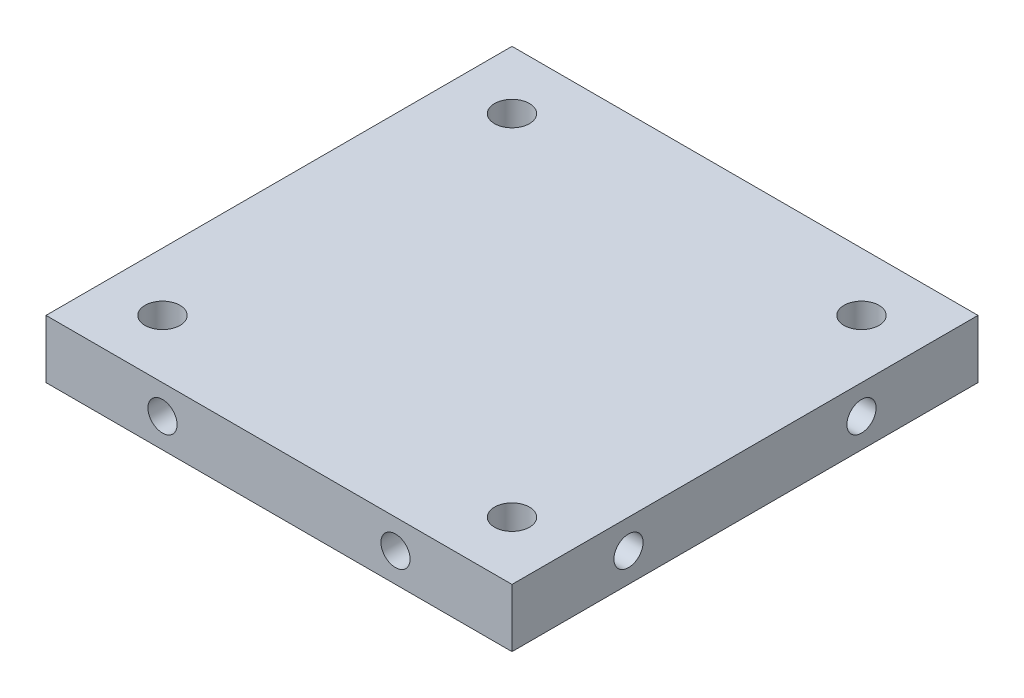
ISO-10303-21;
HEADER;
FILE_DESCRIPTION(('STEP AP214'),'2;1');
FILE_NAME('part.step','',(''),(''),'','','');
FILE_SCHEMA(('AUTOMOTIVE_DESIGN { 1 0 10303 214 1 1 1 1 }'));
ENDSEC;
DATA;
#1=APPLICATION_CONTEXT('core data for automotive mechanical design processes');
#2=APPLICATION_PROTOCOL_DEFINITION('international standard','automotive_design',2000,#1);
#3=PRODUCT_CONTEXT('',#1,'mechanical');
#4=PRODUCT('Part','Part','',(#3));
#5=PRODUCT_RELATED_PRODUCT_CATEGORY('part','',(#4));
#6=PRODUCT_DEFINITION_FORMATION('','',#4);
#7=PRODUCT_DEFINITION_CONTEXT('part definition',#1,'design');
#8=PRODUCT_DEFINITION('design','',#6,#7);
#9=PRODUCT_DEFINITION_SHAPE('','',#8);
#10=(LENGTH_UNIT() NAMED_UNIT(*) SI_UNIT(.MILLI.,.METRE.));
#11=(NAMED_UNIT(*) PLANE_ANGLE_UNIT() SI_UNIT($,.RADIAN.));
#12=(NAMED_UNIT(*) SI_UNIT($,.STERADIAN.) SOLID_ANGLE_UNIT());
#13=UNCERTAINTY_MEASURE_WITH_UNIT(LENGTH_MEASURE(1.E-05),#10,'distance_accuracy_value','');
#14=(GEOMETRIC_REPRESENTATION_CONTEXT(3) GLOBAL_UNCERTAINTY_ASSIGNED_CONTEXT((#13)) GLOBAL_UNIT_ASSIGNED_CONTEXT((#10,
#11,#12)) REPRESENTATION_CONTEXT('',''));
#15=CARTESIAN_POINT('',(0.,0.,0.));
#16=DIRECTION('',(0.,0.,1.));
#17=DIRECTION('',(1.,0.,0.));
#18=AXIS2_PLACEMENT_3D('',#15,#16,#17);
#19=CARTESIAN_POINT('',(20.,5.,20.));
#20=DIRECTION('',(-1.,0.,0.));
#21=DIRECTION('',(0.,0.,1.));
#22=AXIS2_PLACEMENT_3D('',#19,#20,#21);
#23=PLANE('',#22);
#24=CARTESIAN_POINT('',(20.,2.5,-10.0000000000001));
#25=DIRECTION('',(1.,0.,0.));
#26=DIRECTION('',(0.,0.,1.));
#27=AXIS2_PLACEMENT_3D('',#24,#25,#26);
#28=CIRCLE('',#27,1.25);
#29=CARTESIAN_POINT('',(20.,2.5,-8.75000000000007));
#30=VERTEX_POINT('',#29);
#31=EDGE_CURVE('E187',#30,#30,#28,.T.);
#32=ORIENTED_EDGE('',*,*,#31,.F.);
#33=EDGE_LOOP('',(#32));
#34=FACE_BOUND('',#33,.T.);
#35=CARTESIAN_POINT('',(20.,2.5,9.99999999999993));
#36=DIRECTION('',(1.,0.,0.));
#37=DIRECTION('',(0.,0.,-1.));
#38=AXIS2_PLACEMENT_3D('',#35,#36,#37);
#39=CIRCLE('',#38,1.25);
#40=CARTESIAN_POINT('',(20.,2.5,8.74999999999993));
#41=VERTEX_POINT('',#40);
#42=EDGE_CURVE('E165',#41,#41,#39,.T.);
#43=ORIENTED_EDGE('',*,*,#42,.F.);
#44=EDGE_LOOP('',(#43));
#45=FACE_BOUND('',#44,.T.);
#46=DIRECTION('',(0.,0.,-1.));
#47=VECTOR('',#46,1.);
#48=CARTESIAN_POINT('',(20.,0.,20.));
#49=LINE('',#48,#47);
#50=CARTESIAN_POINT('',(20.,0.,20.));
#51=VERTEX_POINT('',#50);
#52=CARTESIAN_POINT('',(20.,0.,-20.));
#53=VERTEX_POINT('',#52);
#54=EDGE_CURVE('E115',#51,#53,#49,.T.);
#55=ORIENTED_EDGE('',*,*,#54,.T.);
#56=DIRECTION('',(0.,-1.,0.));
#57=VECTOR('',#56,1.);
#58=CARTESIAN_POINT('',(20.,5.,-20.));
#59=LINE('',#58,#57);
#60=CARTESIAN_POINT('',(20.,5.,-20.));
#61=VERTEX_POINT('',#60);
#62=EDGE_CURVE('E11',#61,#53,#59,.T.);
#63=ORIENTED_EDGE('',*,*,#62,.F.);
#64=DIRECTION('',(0.,0.,-1.));
#65=VECTOR('',#64,1.);
#66=CARTESIAN_POINT('',(20.,5.,20.));
#67=LINE('',#66,#65);
#68=CARTESIAN_POINT('',(20.,5.,20.));
#69=VERTEX_POINT('',#68);
#70=EDGE_CURVE('E98',#69,#61,#67,.T.);
#71=ORIENTED_EDGE('',*,*,#70,.F.);
#72=DIRECTION('',(0.,-1.,0.));
#73=VECTOR('',#72,1.);
#74=CARTESIAN_POINT('',(20.,5.,20.));
#75=LINE('',#74,#73);
#76=EDGE_CURVE('E111',#69,#51,#75,.T.);
#77=ORIENTED_EDGE('',*,*,#76,.T.);
#78=EDGE_LOOP('',(#55,#63,#71,#77));
#79=FACE_BOUND('',#78,.T.);
#80=ADVANCED_FACE('F44',(#34,#45,#79),#23,.F.);
#81=CARTESIAN_POINT('',(-20.,5.,-20.));
#82=DIRECTION('',(0.,0.,1.));
#83=DIRECTION('',(1.,0.,0.));
#84=AXIS2_PLACEMENT_3D('',#81,#82,#83);
#85=PLANE('',#84);
#86=CARTESIAN_POINT('',(-10.,2.5,-20.));
#87=DIRECTION('',(0.,0.,-1.));
#88=DIRECTION('',(1.,0.,0.));
#89=AXIS2_PLACEMENT_3D('',#86,#87,#88);
#90=CIRCLE('',#89,1.25);
#91=CARTESIAN_POINT('',(-8.75,2.5,-20.));
#92=VERTEX_POINT('',#91);
#93=EDGE_CURVE('E203',#92,#92,#90,.T.);
#94=ORIENTED_EDGE('',*,*,#93,.F.);
#95=EDGE_LOOP('',(#94));
#96=FACE_BOUND('',#95,.T.);
#97=CARTESIAN_POINT('',(10.,2.5,-20.));
#98=DIRECTION('',(0.,0.,-1.));
#99=DIRECTION('',(-1.,0.,0.));
#100=AXIS2_PLACEMENT_3D('',#97,#98,#99);
#101=CIRCLE('',#100,1.25);
#102=CARTESIAN_POINT('',(8.75,2.5,-20.));
#103=VERTEX_POINT('',#102);
#104=EDGE_CURVE('E195',#103,#103,#101,.T.);
#105=ORIENTED_EDGE('',*,*,#104,.F.);
#106=EDGE_LOOP('',(#105));
#107=FACE_BOUND('',#106,.T.);
#108=DIRECTION('',(-1.,0.,0.));
#109=VECTOR('',#108,1.);
#110=CARTESIAN_POINT('',(-20.,0.,-20.));
#111=LINE('',#110,#109);
#112=CARTESIAN_POINT('',(-20.,0.,-20.));
#113=VERTEX_POINT('',#112);
#114=EDGE_CURVE('E103',#53,#113,#111,.T.);
#115=ORIENTED_EDGE('',*,*,#114,.T.);
#116=DIRECTION('',(0.,-1.,0.));
#117=VECTOR('',#116,1.);
#118=CARTESIAN_POINT('',(-20.,5.,-20.));
#119=LINE('',#118,#117);
#120=CARTESIAN_POINT('',(-20.,5.,-20.));
#121=VERTEX_POINT('',#120);
#122=EDGE_CURVE('E54',#121,#113,#119,.T.);
#123=ORIENTED_EDGE('',*,*,#122,.F.);
#124=DIRECTION('',(-1.,0.,0.));
#125=VECTOR('',#124,1.);
#126=CARTESIAN_POINT('',(-20.,5.,-20.));
#127=LINE('',#126,#125);
#128=EDGE_CURVE('E93',#61,#121,#127,.T.);
#129=ORIENTED_EDGE('',*,*,#128,.F.);
#130=ORIENTED_EDGE('',*,*,#62,.T.);
#131=EDGE_LOOP('',(#115,#123,#129,#130));
#132=FACE_BOUND('',#131,.T.);
#133=ADVANCED_FACE('F102',(#96,#107,#132),#85,.F.);
#134=CARTESIAN_POINT('',(-20.,5.,20.));
#135=DIRECTION('',(1.,0.,0.));
#136=DIRECTION('',(0.,0.,-1.));
#137=AXIS2_PLACEMENT_3D('',#134,#135,#136);
#138=PLANE('',#137);
#139=CARTESIAN_POINT('',(-19.9999999999999,2.5,10.0000000000002));
#140=DIRECTION('',(-1.,0.,0.));
#141=DIRECTION('',(0.,0.,-1.));
#142=AXIS2_PLACEMENT_3D('',#139,#140,#141);
#143=CIRCLE('',#142,1.25);
#144=CARTESIAN_POINT('',(-19.9999999999999,2.5,8.75000000000021));
#145=VERTEX_POINT('',#144);
#146=EDGE_CURVE('E145',#145,#145,#143,.T.);
#147=ORIENTED_EDGE('',*,*,#146,.F.);
#148=EDGE_LOOP('',(#147));
#149=FACE_BOUND('',#148,.T.);
#150=CARTESIAN_POINT('',(-20.0000000000001,2.5,-9.99999999999979));
#151=DIRECTION('',(-1.,0.,0.));
#152=DIRECTION('',(0.,0.,1.));
#153=AXIS2_PLACEMENT_3D('',#150,#151,#152);
#154=CIRCLE('',#153,1.25);
#155=CARTESIAN_POINT('',(-20.0000000000001,2.5,-8.74999999999979));
#156=VERTEX_POINT('',#155);
#157=EDGE_CURVE('E156',#156,#156,#154,.T.);
#158=ORIENTED_EDGE('',*,*,#157,.F.);
#159=EDGE_LOOP('',(#158));
#160=FACE_BOUND('',#159,.T.);
#161=DIRECTION('',(0.,0.,1.));
#162=VECTOR('',#161,1.);
#163=CARTESIAN_POINT('',(-20.,0.,20.));
#164=LINE('',#163,#162);
#165=CARTESIAN_POINT('',(-20.,0.,20.));
#166=VERTEX_POINT('',#165);
#167=EDGE_CURVE('E80',#113,#166,#164,.T.);
#168=ORIENTED_EDGE('',*,*,#167,.T.);
#169=DIRECTION('',(0.,-1.,0.));
#170=VECTOR('',#169,1.);
#171=CARTESIAN_POINT('',(-20.,5.,20.));
#172=LINE('',#171,#170);
#173=CARTESIAN_POINT('',(-20.,5.,20.));
#174=VERTEX_POINT('',#173);
#175=EDGE_CURVE('E105',#174,#166,#172,.T.);
#176=ORIENTED_EDGE('',*,*,#175,.F.);
#177=DIRECTION('',(0.,0.,1.));
#178=VECTOR('',#177,1.);
#179=CARTESIAN_POINT('',(-20.,5.,20.));
#180=LINE('',#179,#178);
#181=EDGE_CURVE('E96',#121,#174,#180,.T.);
#182=ORIENTED_EDGE('',*,*,#181,.F.);
#183=ORIENTED_EDGE('',*,*,#122,.T.);
#184=EDGE_LOOP('',(#168,#176,#182,#183));
#185=FACE_BOUND('',#184,.T.);
#186=ADVANCED_FACE('F107',(#149,#160,#185),#138,.F.);
#187=CARTESIAN_POINT('',(-20.,5.,20.));
#188=DIRECTION('',(0.,0.,-1.));
#189=DIRECTION('',(-1.,0.,0.));
#190=AXIS2_PLACEMENT_3D('',#187,#188,#189);
#191=PLANE('',#190);
#192=CARTESIAN_POINT('',(-10.,2.5,20.));
#193=DIRECTION('',(0.,0.,1.));
#194=DIRECTION('',(1.,0.,0.));
#195=AXIS2_PLACEMENT_3D('',#192,#193,#194);
#196=CIRCLE('',#195,1.25);
#197=CARTESIAN_POINT('',(-8.75,2.5,20.));
#198=VERTEX_POINT('',#197);
#199=EDGE_CURVE('E173',#198,#198,#196,.T.);
#200=ORIENTED_EDGE('',*,*,#199,.F.);
#201=EDGE_LOOP('',(#200));
#202=FACE_BOUND('',#201,.T.);
#203=CARTESIAN_POINT('',(10.,2.5,20.));
#204=DIRECTION('',(0.,0.,1.));
#205=DIRECTION('',(-1.,0.,0.));
#206=AXIS2_PLACEMENT_3D('',#203,#204,#205);
#207=CIRCLE('',#206,1.25);
#208=CARTESIAN_POINT('',(8.75,2.5,20.));
#209=VERTEX_POINT('',#208);
#210=EDGE_CURVE('E177',#209,#209,#207,.T.);
#211=ORIENTED_EDGE('',*,*,#210,.F.);
#212=EDGE_LOOP('',(#211));
#213=FACE_BOUND('',#212,.T.);
#214=DIRECTION('',(1.,0.,0.));
#215=VECTOR('',#214,1.);
#216=CARTESIAN_POINT('',(-20.,0.,20.));
#217=LINE('',#216,#215);
#218=EDGE_CURVE('E86',#166,#51,#217,.T.);
#219=ORIENTED_EDGE('',*,*,#218,.T.);
#220=ORIENTED_EDGE('',*,*,#76,.F.);
#221=DIRECTION('',(1.,0.,0.));
#222=VECTOR('',#221,1.);
#223=CARTESIAN_POINT('',(-20.,5.,20.));
#224=LINE('',#223,#222);
#225=EDGE_CURVE('E63',#174,#69,#224,.T.);
#226=ORIENTED_EDGE('',*,*,#225,.F.);
#227=ORIENTED_EDGE('',*,*,#175,.T.);
#228=EDGE_LOOP('',(#219,#220,#226,#227));
#229=FACE_BOUND('',#228,.T.);
#230=ADVANCED_FACE('F237',(#202,#213,#229),#191,.F.);
#231=CARTESIAN_POINT('',(0.,5.,0.));
#232=DIRECTION('',(0.,-1.,0.));
#233=DIRECTION('',(0.,0.,-1.));
#234=AXIS2_PLACEMENT_3D('',#231,#232,#233);
#235=PLANE('',#234);
#236=CARTESIAN_POINT('',(-15.,5.,15.));
#237=DIRECTION('',(0.,1.,0.));
#238=DIRECTION('',(0.,0.,1.));
#239=AXIS2_PLACEMENT_3D('',#236,#237,#238);
#240=CIRCLE('',#239,1.5);
#241=CARTESIAN_POINT('',(-15.,5.,16.5));
#242=VERTEX_POINT('',#241);
#243=EDGE_CURVE('E220',#242,#242,#240,.T.);
#244=ORIENTED_EDGE('',*,*,#243,.F.);
#245=EDGE_LOOP('',(#244));
#246=FACE_BOUND('',#245,.T.);
#247=CARTESIAN_POINT('',(15.,5.,15.));
#248=DIRECTION('',(0.,1.,0.));
#249=DIRECTION('',(0.,0.,1.));
#250=AXIS2_PLACEMENT_3D('',#247,#248,#249);
#251=CIRCLE('',#250,1.5);
#252=CARTESIAN_POINT('',(15.,5.,16.5));
#253=VERTEX_POINT('',#252);
#254=EDGE_CURVE('E224',#253,#253,#251,.T.);
#255=ORIENTED_EDGE('',*,*,#254,.F.);
#256=EDGE_LOOP('',(#255));
#257=FACE_BOUND('',#256,.T.);
#258=CARTESIAN_POINT('',(15.,5.,-15.));
#259=DIRECTION('',(0.,1.,0.));
#260=DIRECTION('',(0.,0.,1.));
#261=AXIS2_PLACEMENT_3D('',#258,#259,#260);
#262=CIRCLE('',#261,1.5);
#263=CARTESIAN_POINT('',(15.,5.,-13.5));
#264=VERTEX_POINT('',#263);
#265=EDGE_CURVE('E219',#264,#264,#262,.T.);
#266=ORIENTED_EDGE('',*,*,#265,.F.);
#267=EDGE_LOOP('',(#266));
#268=FACE_BOUND('',#267,.T.);
#269=CARTESIAN_POINT('',(-15.,5.,-15.));
#270=DIRECTION('',(0.,1.,0.));
#271=DIRECTION('',(0.,0.,1.));
#272=AXIS2_PLACEMENT_3D('',#269,#270,#271);
#273=CIRCLE('',#272,1.5);
#274=CARTESIAN_POINT('',(-15.,5.,-13.5));
#275=VERTEX_POINT('',#274);
#276=EDGE_CURVE('E135',#275,#275,#273,.T.);
#277=ORIENTED_EDGE('',*,*,#276,.F.);
#278=EDGE_LOOP('',(#277));
#279=FACE_BOUND('',#278,.T.);
#280=ORIENTED_EDGE('',*,*,#70,.T.);
#281=ORIENTED_EDGE('',*,*,#128,.T.);
#282=ORIENTED_EDGE('',*,*,#181,.T.);
#283=ORIENTED_EDGE('',*,*,#225,.T.);
#284=EDGE_LOOP('',(#280,#281,#282,#283));
#285=FACE_BOUND('',#284,.T.);
#286=ADVANCED_FACE('F94',(#246,#257,#268,#279,#285),#235,.F.);
#287=CARTESIAN_POINT('',(0.,0.,0.));
#288=DIRECTION('',(0.,-1.,0.));
#289=DIRECTION('',(0.,0.,-1.));
#290=AXIS2_PLACEMENT_3D('',#287,#288,#289);
#291=PLANE('',#290);
#292=CARTESIAN_POINT('',(-15.,0.,15.));
#293=DIRECTION('',(0.,-1.,0.));
#294=DIRECTION('',(0.,0.,-1.));
#295=AXIS2_PLACEMENT_3D('',#292,#293,#294);
#296=CIRCLE('',#295,1.5);
#297=CARTESIAN_POINT('',(-15.,0.,13.5));
#298=VERTEX_POINT('',#297);
#299=EDGE_CURVE('E47',#298,#298,#296,.T.);
#300=ORIENTED_EDGE('',*,*,#299,.F.);
#301=EDGE_LOOP('',(#300));
#302=FACE_BOUND('',#301,.T.);
#303=CARTESIAN_POINT('',(15.,0.,15.));
#304=DIRECTION('',(0.,-1.,0.));
#305=DIRECTION('',(0.,0.,-1.));
#306=AXIS2_PLACEMENT_3D('',#303,#304,#305);
#307=CIRCLE('',#306,1.5);
#308=CARTESIAN_POINT('',(15.,0.,13.5));
#309=VERTEX_POINT('',#308);
#310=EDGE_CURVE('E138',#309,#309,#307,.T.);
#311=ORIENTED_EDGE('',*,*,#310,.F.);
#312=EDGE_LOOP('',(#311));
#313=FACE_BOUND('',#312,.T.);
#314=CARTESIAN_POINT('',(15.,0.,-15.));
#315=DIRECTION('',(0.,-1.,0.));
#316=DIRECTION('',(0.,0.,-1.));
#317=AXIS2_PLACEMENT_3D('',#314,#315,#316);
#318=CIRCLE('',#317,1.5);
#319=CARTESIAN_POINT('',(15.,0.,-16.5));
#320=VERTEX_POINT('',#319);
#321=EDGE_CURVE('E134',#320,#320,#318,.T.);
#322=ORIENTED_EDGE('',*,*,#321,.F.);
#323=EDGE_LOOP('',(#322));
#324=FACE_BOUND('',#323,.T.);
#325=CARTESIAN_POINT('',(-15.,0.,-15.));
#326=DIRECTION('',(0.,-1.,0.));
#327=DIRECTION('',(0.,0.,-1.));
#328=AXIS2_PLACEMENT_3D('',#325,#326,#327);
#329=CIRCLE('',#328,1.5);
#330=CARTESIAN_POINT('',(-15.,0.,-16.5));
#331=VERTEX_POINT('',#330);
#332=EDGE_CURVE('E130',#331,#331,#329,.T.);
#333=ORIENTED_EDGE('',*,*,#332,.F.);
#334=EDGE_LOOP('',(#333));
#335=FACE_BOUND('',#334,.T.);
#336=ORIENTED_EDGE('',*,*,#54,.F.);
#337=ORIENTED_EDGE('',*,*,#218,.F.);
#338=ORIENTED_EDGE('',*,*,#167,.F.);
#339=ORIENTED_EDGE('',*,*,#114,.F.);
#340=EDGE_LOOP('',(#336,#337,#338,#339));
#341=FACE_BOUND('',#340,.T.);
#342=ADVANCED_FACE('F236',(#302,#313,#324,#335,#341),#291,.T.);
#343=CARTESIAN_POINT('',(10.,2.5,15.));
#344=DIRECTION('',(0.,0.,1.));
#345=DIRECTION('',(1.,0.,0.));
#346=AXIS2_PLACEMENT_3D('',#343,#344,#345);
#347=CYLINDRICAL_SURFACE('',#346,1.25);
#348=CARTESIAN_POINT('',(10.,2.5,15.));
#349=DIRECTION('',(0.,0.,1.));
#350=DIRECTION('',(-1.,0.,0.));
#351=AXIS2_PLACEMENT_3D('',#348,#349,#350);
#352=CIRCLE('',#351,1.25);
#353=CARTESIAN_POINT('',(8.75,2.5,15.));
#354=VERTEX_POINT('',#353);
#355=EDGE_CURVE('E164',#354,#354,#352,.T.);
#356=ORIENTED_EDGE('',*,*,#355,.F.);
#357=EDGE_LOOP('',(#356));
#358=FACE_BOUND('',#357,.T.);
#359=ORIENTED_EDGE('',*,*,#210,.T.);
#360=EDGE_LOOP('',(#359));
#361=FACE_BOUND('',#360,.T.);
#362=ADVANCED_FACE('F272',(#358,#361),#347,.F.);
#363=CARTESIAN_POINT('',(10.,2.5,15.));
#364=DIRECTION('',(0.,0.,-1.));
#365=DIRECTION('',(-1.,0.,0.));
#366=AXIS2_PLACEMENT_3D('',#363,#364,#365);
#367=PLANE('',#366);
#368=ORIENTED_EDGE('',*,*,#355,.T.);
#369=EDGE_LOOP('',(#368));
#370=FACE_BOUND('',#369,.T.);
#371=ADVANCED_FACE('F278',(#370),#367,.F.);
#372=CARTESIAN_POINT('',(-10.,2.5,15.));
#373=DIRECTION('',(0.,0.,1.));
#374=DIRECTION('',(1.,0.,0.));
#375=AXIS2_PLACEMENT_3D('',#372,#373,#374);
#376=CYLINDRICAL_SURFACE('',#375,1.25);
#377=CARTESIAN_POINT('',(-10.,2.5,15.));
#378=DIRECTION('',(0.,0.,1.));
#379=DIRECTION('',(1.,0.,0.));
#380=AXIS2_PLACEMENT_3D('',#377,#378,#379);
#381=CIRCLE('',#380,1.25);
#382=CARTESIAN_POINT('',(-8.75,2.5,15.));
#383=VERTEX_POINT('',#382);
#384=EDGE_CURVE('E119',#383,#383,#381,.T.);
#385=ORIENTED_EDGE('',*,*,#384,.F.);
#386=EDGE_LOOP('',(#385));
#387=FACE_BOUND('',#386,.T.);
#388=ORIENTED_EDGE('',*,*,#199,.T.);
#389=EDGE_LOOP('',(#388));
#390=FACE_BOUND('',#389,.T.);
#391=ADVANCED_FACE('F428',(#387,#390),#376,.F.);
#392=CARTESIAN_POINT('',(-10.,2.5,15.));
#393=DIRECTION('',(0.,0.,1.));
#394=DIRECTION('',(1.,0.,0.));
#395=AXIS2_PLACEMENT_3D('',#392,#393,#394);
#396=PLANE('',#395);
#397=ORIENTED_EDGE('',*,*,#384,.T.);
#398=EDGE_LOOP('',(#397));
#399=FACE_BOUND('',#398,.T.);
#400=ADVANCED_FACE('F304',(#399),#396,.T.);
#401=CARTESIAN_POINT('',(-15.0000000000001,2.5,-9.99999999999984));
#402=DIRECTION('',(-1.,0.,0.));
#403=DIRECTION('',(0.,0.,1.));
#404=AXIS2_PLACEMENT_3D('',#401,#402,#403);
#405=CYLINDRICAL_SURFACE('',#404,1.25);
#406=CARTESIAN_POINT('',(-15.0000000000001,2.5,-9.99999999999984));
#407=DIRECTION('',(-1.,0.,0.));
#408=DIRECTION('',(0.,0.,1.));
#409=AXIS2_PLACEMENT_3D('',#406,#407,#408);
#410=CIRCLE('',#409,1.25);
#411=CARTESIAN_POINT('',(-15.0000000000001,2.5,-8.74999999999984));
#412=VERTEX_POINT('',#411);
#413=EDGE_CURVE('E207',#412,#412,#410,.T.);
#414=ORIENTED_EDGE('',*,*,#413,.F.);
#415=EDGE_LOOP('',(#414));
#416=FACE_BOUND('',#415,.T.);
#417=ORIENTED_EDGE('',*,*,#157,.T.);
#418=EDGE_LOOP('',(#417));
#419=FACE_BOUND('',#418,.T.);
#420=ADVANCED_FACE('F299',(#416,#419),#405,.F.);
#421=CARTESIAN_POINT('',(-15.0000000000001,2.5,-9.99999999999984));
#422=DIRECTION('',(-1.,0.,0.));
#423=DIRECTION('',(0.,0.,1.));
#424=AXIS2_PLACEMENT_3D('',#421,#422,#423);
#425=PLANE('',#424);
#426=ORIENTED_EDGE('',*,*,#413,.T.);
#427=EDGE_LOOP('',(#426));
#428=FACE_BOUND('',#427,.T.);
#429=ADVANCED_FACE('F303',(#428),#425,.T.);
#430=CARTESIAN_POINT('',(-14.9999999999999,2.5,10.0000000000002));
#431=DIRECTION('',(-1.,0.,0.));
#432=DIRECTION('',(0.,0.,1.));
#433=AXIS2_PLACEMENT_3D('',#430,#431,#432);
#434=CYLINDRICAL_SURFACE('',#433,1.25);
#435=CARTESIAN_POINT('',(-14.9999999999999,2.5,10.0000000000002));
#436=DIRECTION('',(-1.,0.,0.));
#437=DIRECTION('',(0.,0.,-1.));
#438=AXIS2_PLACEMENT_3D('',#435,#436,#437);
#439=CIRCLE('',#438,1.25);
#440=CARTESIAN_POINT('',(-14.9999999999999,2.5,8.75000000000016));
#441=VERTEX_POINT('',#440);
#442=EDGE_CURVE('E150',#441,#441,#439,.T.);
#443=ORIENTED_EDGE('',*,*,#442,.F.);
#444=EDGE_LOOP('',(#443));
#445=FACE_BOUND('',#444,.T.);
#446=ORIENTED_EDGE('',*,*,#146,.T.);
#447=EDGE_LOOP('',(#446));
#448=FACE_BOUND('',#447,.T.);
#449=ADVANCED_FACE('F314',(#445,#448),#434,.F.);
#450=CARTESIAN_POINT('',(-14.9999999999999,2.5,10.0000000000002));
#451=DIRECTION('',(1.,0.,0.));
#452=DIRECTION('',(0.,0.,-1.));
#453=AXIS2_PLACEMENT_3D('',#450,#451,#452);
#454=PLANE('',#453);
#455=ORIENTED_EDGE('',*,*,#442,.T.);
#456=EDGE_LOOP('',(#455));
#457=FACE_BOUND('',#456,.T.);
#458=ADVANCED_FACE('F323',(#457),#454,.F.);
#459=CARTESIAN_POINT('',(10.,2.5,-15.));
#460=DIRECTION('',(0.,0.,-1.));
#461=DIRECTION('',(-1.,0.,0.));
#462=AXIS2_PLACEMENT_3D('',#459,#460,#461);
#463=CYLINDRICAL_SURFACE('',#462,1.25);
#464=CARTESIAN_POINT('',(10.,2.5,-15.));
#465=DIRECTION('',(0.,0.,-1.));
#466=DIRECTION('',(-1.,0.,0.));
#467=AXIS2_PLACEMENT_3D('',#464,#465,#466);
#468=CIRCLE('',#467,1.25);
#469=CARTESIAN_POINT('',(8.75,2.5,-15.));
#470=VERTEX_POINT('',#469);
#471=EDGE_CURVE('E191',#470,#470,#468,.T.);
#472=ORIENTED_EDGE('',*,*,#471,.F.);
#473=EDGE_LOOP('',(#472));
#474=FACE_BOUND('',#473,.T.);
#475=ORIENTED_EDGE('',*,*,#104,.T.);
#476=EDGE_LOOP('',(#475));
#477=FACE_BOUND('',#476,.T.);
#478=ADVANCED_FACE('F332',(#474,#477),#463,.F.);
#479=CARTESIAN_POINT('',(10.,2.5,-15.));
#480=DIRECTION('',(0.,0.,-1.));
#481=DIRECTION('',(-1.,0.,0.));
#482=AXIS2_PLACEMENT_3D('',#479,#480,#481);
#483=PLANE('',#482);
#484=ORIENTED_EDGE('',*,*,#471,.T.);
#485=EDGE_LOOP('',(#484));
#486=FACE_BOUND('',#485,.T.);
#487=ADVANCED_FACE('F341',(#486),#483,.T.);
#488=CARTESIAN_POINT('',(-10.,2.5,-15.));
#489=DIRECTION('',(0.,0.,-1.));
#490=DIRECTION('',(-1.,0.,0.));
#491=AXIS2_PLACEMENT_3D('',#488,#489,#490);
#492=CYLINDRICAL_SURFACE('',#491,1.25);
#493=CARTESIAN_POINT('',(-10.,2.5,-15.));
#494=DIRECTION('',(0.,0.,-1.));
#495=DIRECTION('',(1.,0.,0.));
#496=AXIS2_PLACEMENT_3D('',#493,#494,#495);
#497=CIRCLE('',#496,1.25);
#498=CARTESIAN_POINT('',(-8.75,2.5,-15.));
#499=VERTEX_POINT('',#498);
#500=EDGE_CURVE('E199',#499,#499,#497,.T.);
#501=ORIENTED_EDGE('',*,*,#500,.F.);
#502=EDGE_LOOP('',(#501));
#503=FACE_BOUND('',#502,.T.);
#504=ORIENTED_EDGE('',*,*,#93,.T.);
#505=EDGE_LOOP('',(#504));
#506=FACE_BOUND('',#505,.T.);
#507=ADVANCED_FACE('F350',(#503,#506),#492,.F.);
#508=CARTESIAN_POINT('',(-10.,2.5,-15.));
#509=DIRECTION('',(0.,0.,1.));
#510=DIRECTION('',(1.,0.,0.));
#511=AXIS2_PLACEMENT_3D('',#508,#509,#510);
#512=PLANE('',#511);
#513=ORIENTED_EDGE('',*,*,#500,.T.);
#514=EDGE_LOOP('',(#513));
#515=FACE_BOUND('',#514,.T.);
#516=ADVANCED_FACE('F359',(#515),#512,.F.);
#517=CARTESIAN_POINT('',(15.,2.5,9.99999999999995));
#518=DIRECTION('',(1.,0.,0.));
#519=DIRECTION('',(0.,0.,-1.));
#520=AXIS2_PLACEMENT_3D('',#517,#518,#519);
#521=CYLINDRICAL_SURFACE('',#520,1.25);
#522=CARTESIAN_POINT('',(15.,2.5,9.99999999999995));
#523=DIRECTION('',(1.,0.,0.));
#524=DIRECTION('',(0.,0.,-1.));
#525=AXIS2_PLACEMENT_3D('',#522,#523,#524);
#526=CIRCLE('',#525,1.25);
#527=CARTESIAN_POINT('',(15.,2.5,8.74999999999995));
#528=VERTEX_POINT('',#527);
#529=EDGE_CURVE('E160',#528,#528,#526,.T.);
#530=ORIENTED_EDGE('',*,*,#529,.F.);
#531=EDGE_LOOP('',(#530));
#532=FACE_BOUND('',#531,.T.);
#533=ORIENTED_EDGE('',*,*,#42,.T.);
#534=EDGE_LOOP('',(#533));
#535=FACE_BOUND('',#534,.T.);
#536=ADVANCED_FACE('F368',(#532,#535),#521,.F.);
#537=CARTESIAN_POINT('',(15.,2.5,9.99999999999995));
#538=DIRECTION('',(1.,0.,0.));
#539=DIRECTION('',(0.,0.,-1.));
#540=AXIS2_PLACEMENT_3D('',#537,#538,#539);
#541=PLANE('',#540);
#542=ORIENTED_EDGE('',*,*,#529,.T.);
#543=EDGE_LOOP('',(#542));
#544=FACE_BOUND('',#543,.T.);
#545=ADVANCED_FACE('F377',(#544),#541,.T.);
#546=CARTESIAN_POINT('',(15.,2.5,-10.0000000000001));
#547=DIRECTION('',(1.,0.,0.));
#548=DIRECTION('',(0.,0.,-1.));
#549=AXIS2_PLACEMENT_3D('',#546,#547,#548);
#550=CYLINDRICAL_SURFACE('',#549,1.25);
#551=CARTESIAN_POINT('',(15.,2.5,-10.0000000000001));
#552=DIRECTION('',(1.,0.,0.));
#553=DIRECTION('',(0.,0.,1.));
#554=AXIS2_PLACEMENT_3D('',#551,#552,#553);
#555=CIRCLE('',#554,1.25);
#556=CARTESIAN_POINT('',(15.,2.5,-8.75000000000005));
#557=VERTEX_POINT('',#556);
#558=EDGE_CURVE('E169',#557,#557,#555,.T.);
#559=ORIENTED_EDGE('',*,*,#558,.F.);
#560=EDGE_LOOP('',(#559));
#561=FACE_BOUND('',#560,.T.);
#562=ORIENTED_EDGE('',*,*,#31,.T.);
#563=EDGE_LOOP('',(#562));
#564=FACE_BOUND('',#563,.T.);
#565=ADVANCED_FACE('F255',(#561,#564),#550,.F.);
#566=CARTESIAN_POINT('',(15.,2.5,-10.0000000000001));
#567=DIRECTION('',(-1.,0.,0.));
#568=DIRECTION('',(0.,0.,1.));
#569=AXIS2_PLACEMENT_3D('',#566,#567,#568);
#570=PLANE('',#569);
#571=ORIENTED_EDGE('',*,*,#558,.T.);
#572=EDGE_LOOP('',(#571));
#573=FACE_BOUND('',#572,.T.);
#574=ADVANCED_FACE('F244',(#573),#570,.F.);
#575=CARTESIAN_POINT('',(-15.,-5.,-15.));
#576=DIRECTION('',(0.,1.,0.));
#577=DIRECTION('',(0.,0.,1.));
#578=AXIS2_PLACEMENT_3D('',#575,#576,#577);
#579=CYLINDRICAL_SURFACE('',#578,1.5);
#580=ORIENTED_EDGE('',*,*,#332,.T.);
#581=EDGE_LOOP('',(#580));
#582=FACE_BOUND('',#581,.T.);
#583=ORIENTED_EDGE('',*,*,#276,.T.);
#584=EDGE_LOOP('',(#583));
#585=FACE_BOUND('',#584,.T.);
#586=ADVANCED_FACE('F242',(#582,#585),#579,.F.);
#587=CARTESIAN_POINT('',(15.,-5.,-15.));
#588=DIRECTION('',(0.,1.,0.));
#589=DIRECTION('',(0.,0.,1.));
#590=AXIS2_PLACEMENT_3D('',#587,#588,#589);
#591=CYLINDRICAL_SURFACE('',#590,1.5);
#592=ORIENTED_EDGE('',*,*,#321,.T.);
#593=EDGE_LOOP('',(#592));
#594=FACE_BOUND('',#593,.T.);
#595=ORIENTED_EDGE('',*,*,#265,.T.);
#596=EDGE_LOOP('',(#595));
#597=FACE_BOUND('',#596,.T.);
#598=ADVANCED_FACE('F232',(#594,#597),#591,.F.);
#599=CARTESIAN_POINT('',(15.,-5.,15.));
#600=DIRECTION('',(0.,1.,0.));
#601=DIRECTION('',(0.,0.,1.));
#602=AXIS2_PLACEMENT_3D('',#599,#600,#601);
#603=CYLINDRICAL_SURFACE('',#602,1.5);
#604=ORIENTED_EDGE('',*,*,#310,.T.);
#605=EDGE_LOOP('',(#604));
#606=FACE_BOUND('',#605,.T.);
#607=ORIENTED_EDGE('',*,*,#254,.T.);
#608=EDGE_LOOP('',(#607));
#609=FACE_BOUND('',#608,.T.);
#610=ADVANCED_FACE('F251',(#606,#609),#603,.F.);
#611=CARTESIAN_POINT('',(-15.,-5.,15.));
#612=DIRECTION('',(0.,1.,0.));
#613=DIRECTION('',(0.,0.,1.));
#614=AXIS2_PLACEMENT_3D('',#611,#612,#613);
#615=CYLINDRICAL_SURFACE('',#614,1.5);
#616=ORIENTED_EDGE('',*,*,#299,.T.);
#617=EDGE_LOOP('',(#616));
#618=FACE_BOUND('',#617,.T.);
#619=ORIENTED_EDGE('',*,*,#243,.T.);
#620=EDGE_LOOP('',(#619));
#621=FACE_BOUND('',#620,.T.);
#622=ADVANCED_FACE('F473',(#618,#621),#615,.F.);
#623=CLOSED_SHELL('',(#80,#133,#186,#230,#286,#342,#362,#371,#391,#400,#420,#429,#449,#458,#478,
#487,#507,#516,#536,#545,#565,#574,#586,#598,#610,#622));
#624=MANIFOLD_SOLID_BREP('B2',#623);
#625=ADVANCED_BREP_SHAPE_REPRESENTATION('',(#18,#624),#14);
#626=SHAPE_DEFINITION_REPRESENTATION(#9,#625);
ENDSEC;
END-ISO-10303-21;
